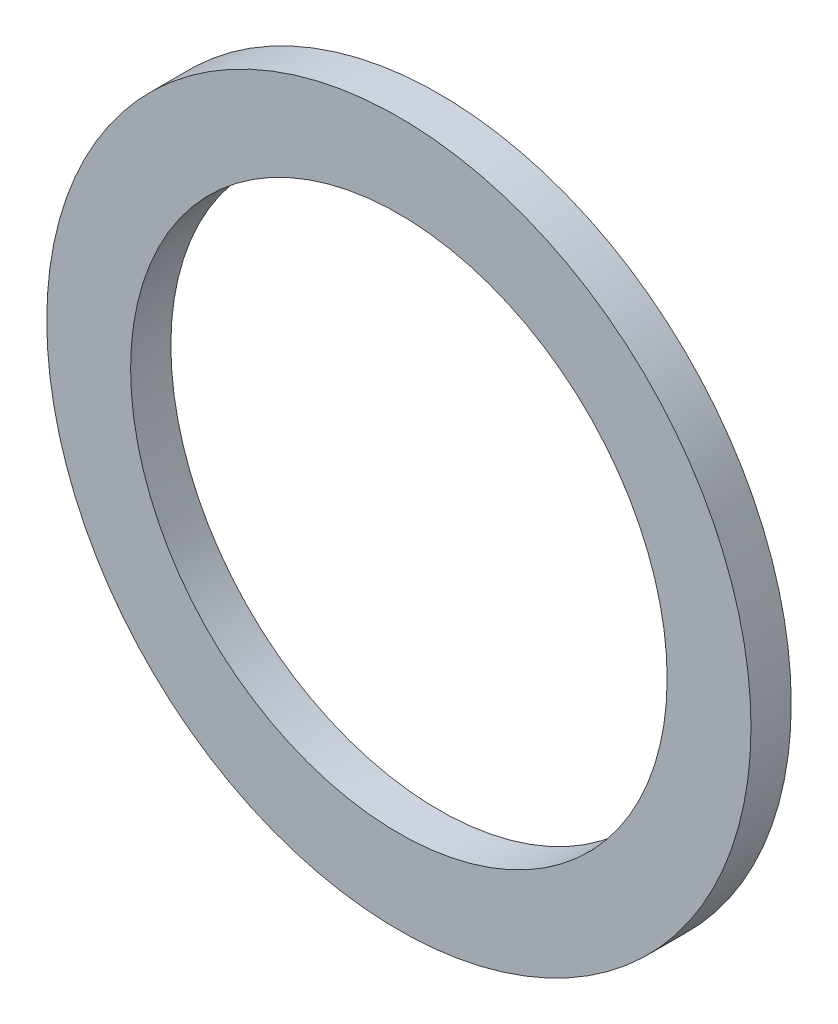
ISO-10303-21;
HEADER;
FILE_DESCRIPTION(('STEP AP214'),'2;1');
FILE_NAME('part.step','',(''),(''),'','','');
FILE_SCHEMA(('AUTOMOTIVE_DESIGN { 1 0 10303 214 1 1 1 1 }'));
ENDSEC;
DATA;
#1=APPLICATION_CONTEXT('core data for automotive mechanical design processes');
#2=APPLICATION_PROTOCOL_DEFINITION('international standard','automotive_design',2000,#1);
#3=PRODUCT_CONTEXT('',#1,'mechanical');
#4=PRODUCT('Part','Part','',(#3));
#5=PRODUCT_RELATED_PRODUCT_CATEGORY('part','',(#4));
#6=PRODUCT_DEFINITION_FORMATION('','',#4);
#7=PRODUCT_DEFINITION_CONTEXT('part definition',#1,'design');
#8=PRODUCT_DEFINITION('design','',#6,#7);
#9=PRODUCT_DEFINITION_SHAPE('','',#8);
#10=(LENGTH_UNIT() NAMED_UNIT(*) SI_UNIT(.MILLI.,.METRE.));
#11=(NAMED_UNIT(*) PLANE_ANGLE_UNIT() SI_UNIT($,.RADIAN.));
#12=(NAMED_UNIT(*) SI_UNIT($,.STERADIAN.) SOLID_ANGLE_UNIT());
#13=UNCERTAINTY_MEASURE_WITH_UNIT(LENGTH_MEASURE(1.E-05),#10,'distance_accuracy_value','');
#14=(GEOMETRIC_REPRESENTATION_CONTEXT(3) GLOBAL_UNCERTAINTY_ASSIGNED_CONTEXT((#13)) GLOBAL_UNIT_ASSIGNED_CONTEXT((#10,
#11,#12)) REPRESENTATION_CONTEXT('',''));
#15=CARTESIAN_POINT('',(0.,0.,0.));
#16=DIRECTION('',(0.,0.,1.));
#17=DIRECTION('',(1.,0.,0.));
#18=AXIS2_PLACEMENT_3D('',#15,#16,#17);
#19=CARTESIAN_POINT('',(0.,0.,6.));
#20=DIRECTION('',(0.,0.,1.));
#21=DIRECTION('',(1.,0.,0.));
#22=AXIS2_PLACEMENT_3D('',#19,#20,#21);
#23=PLANE('',#22);
#24=CARTESIAN_POINT('',(0.,0.,6.));
#25=DIRECTION('',(0.,0.,1.));
#26=DIRECTION('',(1.,0.,0.));
#27=AXIS2_PLACEMENT_3D('',#24,#25,#26);
#28=CIRCLE('',#27,52.5);
#29=CARTESIAN_POINT('',(52.5,0.,6.));
#30=VERTEX_POINT('',#29);
#31=EDGE_CURVE('E10',#30,#30,#28,.T.);
#32=ORIENTED_EDGE('',*,*,#31,.T.);
#33=EDGE_LOOP('',(#32));
#34=FACE_BOUND('',#33,.T.);
#35=CARTESIAN_POINT('',(0.,0.,6.));
#36=DIRECTION('',(0.,0.,1.));
#37=DIRECTION('',(1.,0.,0.));
#38=AXIS2_PLACEMENT_3D('',#35,#36,#37);
#39=CIRCLE('',#38,40.);
#40=CARTESIAN_POINT('',(40.,0.,6.));
#41=VERTEX_POINT('',#40);
#42=EDGE_CURVE('E45',#41,#41,#39,.T.);
#43=ORIENTED_EDGE('',*,*,#42,.F.);
#44=EDGE_LOOP('',(#43));
#45=FACE_BOUND('',#44,.T.);
#46=ADVANCED_FACE('F34',(#34,#45),#23,.T.);
#47=CARTESIAN_POINT('',(0.,0.,0.));
#48=DIRECTION('',(0.,0.,1.));
#49=DIRECTION('',(1.,0.,0.));
#50=AXIS2_PLACEMENT_3D('',#47,#48,#49);
#51=PLANE('',#50);
#52=CARTESIAN_POINT('',(0.,0.,0.));
#53=DIRECTION('',(0.,0.,1.));
#54=DIRECTION('',(1.,0.,0.));
#55=AXIS2_PLACEMENT_3D('',#52,#53,#54);
#56=CIRCLE('',#55,52.5);
#57=CARTESIAN_POINT('',(52.5,0.,0.));
#58=VERTEX_POINT('',#57);
#59=EDGE_CURVE('E38',#58,#58,#56,.T.);
#60=ORIENTED_EDGE('',*,*,#59,.F.);
#61=EDGE_LOOP('',(#60));
#62=FACE_BOUND('',#61,.T.);
#63=CARTESIAN_POINT('',(0.,0.,0.));
#64=DIRECTION('',(0.,0.,1.));
#65=DIRECTION('',(1.,0.,0.));
#66=AXIS2_PLACEMENT_3D('',#63,#64,#65);
#67=CIRCLE('',#66,40.);
#68=CARTESIAN_POINT('',(40.,0.,0.));
#69=VERTEX_POINT('',#68);
#70=EDGE_CURVE('E47',#69,#69,#67,.T.);
#71=ORIENTED_EDGE('',*,*,#70,.T.);
#72=EDGE_LOOP('',(#71));
#73=FACE_BOUND('',#72,.T.);
#74=ADVANCED_FACE('F57',(#62,#73),#51,.F.);
#75=CARTESIAN_POINT('',(0.,0.,6.));
#76=DIRECTION('',(0.,0.,-1.));
#77=DIRECTION('',(-1.,0.,0.));
#78=AXIS2_PLACEMENT_3D('',#75,#76,#77);
#79=CYLINDRICAL_SURFACE('',#78,52.5);
#80=ORIENTED_EDGE('',*,*,#31,.F.);
#81=EDGE_LOOP('',(#80));
#82=FACE_BOUND('',#81,.T.);
#83=ORIENTED_EDGE('',*,*,#59,.T.);
#84=EDGE_LOOP('',(#83));
#85=FACE_BOUND('',#84,.T.);
#86=ADVANCED_FACE('F36',(#82,#85),#79,.T.);
#87=CARTESIAN_POINT('',(0.,0.,6.));
#88=DIRECTION('',(0.,0.,-1.));
#89=DIRECTION('',(-1.,0.,0.));
#90=AXIS2_PLACEMENT_3D('',#87,#88,#89);
#91=CYLINDRICAL_SURFACE('',#90,40.);
#92=ORIENTED_EDGE('',*,*,#42,.T.);
#93=EDGE_LOOP('',(#92));
#94=FACE_BOUND('',#93,.T.);
#95=ORIENTED_EDGE('',*,*,#70,.F.);
#96=EDGE_LOOP('',(#95));
#97=FACE_BOUND('',#96,.T.);
#98=ADVANCED_FACE('F53',(#94,#97),#91,.F.);
#99=CLOSED_SHELL('',(#46,#74,#86,#98));
#100=MANIFOLD_SOLID_BREP('B2',#99);
#101=ADVANCED_BREP_SHAPE_REPRESENTATION('',(#18,#100),#14);
#102=SHAPE_DEFINITION_REPRESENTATION(#9,#101);
ENDSEC;
END-ISO-10303-21;
